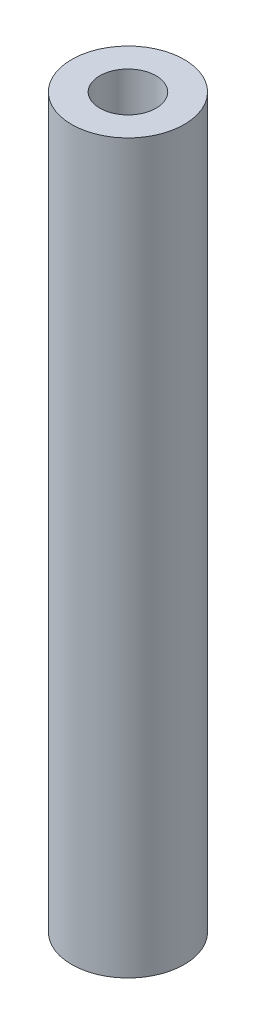
ISO-10303-21;
HEADER;
FILE_DESCRIPTION(('STEP AP214'),'2;1');
FILE_NAME('part.step','',(''),(''),'','','');
FILE_SCHEMA(('AUTOMOTIVE_DESIGN { 1 0 10303 214 1 1 1 1 }'));
ENDSEC;
DATA;
#1=APPLICATION_CONTEXT('core data for automotive mechanical design processes');
#2=APPLICATION_PROTOCOL_DEFINITION('international standard','automotive_design',2000,#1);
#3=PRODUCT_CONTEXT('',#1,'mechanical');
#4=PRODUCT('Part','Part','',(#3));
#5=PRODUCT_RELATED_PRODUCT_CATEGORY('part','',(#4));
#6=PRODUCT_DEFINITION_FORMATION('','',#4);
#7=PRODUCT_DEFINITION_CONTEXT('part definition',#1,'design');
#8=PRODUCT_DEFINITION('design','',#6,#7);
#9=PRODUCT_DEFINITION_SHAPE('','',#8);
#10=(LENGTH_UNIT() NAMED_UNIT(*) SI_UNIT(.MILLI.,.METRE.));
#11=(NAMED_UNIT(*) PLANE_ANGLE_UNIT() SI_UNIT($,.RADIAN.));
#12=(NAMED_UNIT(*) SI_UNIT($,.STERADIAN.) SOLID_ANGLE_UNIT());
#13=UNCERTAINTY_MEASURE_WITH_UNIT(LENGTH_MEASURE(1.E-05),#10,'distance_accuracy_value','');
#14=(GEOMETRIC_REPRESENTATION_CONTEXT(3) GLOBAL_UNCERTAINTY_ASSIGNED_CONTEXT((#13)) GLOBAL_UNIT_ASSIGNED_CONTEXT((#10,
#11,#12)) REPRESENTATION_CONTEXT('',''));
#15=CARTESIAN_POINT('',(0.,0.,0.));
#16=DIRECTION('',(0.,0.,1.));
#17=DIRECTION('',(1.,0.,0.));
#18=AXIS2_PLACEMENT_3D('',#15,#16,#17);
#19=CARTESIAN_POINT('',(0.,82.042,0.));
#20=DIRECTION('',(0.,1.,0.));
#21=DIRECTION('',(0.,0.,1.));
#22=AXIS2_PLACEMENT_3D('',#19,#20,#21);
#23=PLANE('',#22);
#24=CARTESIAN_POINT('',(0.,82.042,0.));
#25=DIRECTION('',(0.,1.,0.));
#26=DIRECTION('',(0.,0.,1.));
#27=AXIS2_PLACEMENT_3D('',#24,#25,#26);
#28=CIRCLE('',#27,6.35);
#29=CARTESIAN_POINT('',(0.,82.042,6.35));
#30=VERTEX_POINT('',#29);
#31=EDGE_CURVE('E10',#30,#30,#28,.T.);
#32=ORIENTED_EDGE('',*,*,#31,.T.);
#33=EDGE_LOOP('',(#32));
#34=FACE_BOUND('',#33,.T.);
#35=CARTESIAN_POINT('',(0.,82.042,0.));
#36=DIRECTION('',(0.,1.,0.));
#37=DIRECTION('',(0.,0.,1.));
#38=AXIS2_PLACEMENT_3D('',#35,#36,#37);
#39=CIRCLE('',#38,3.175);
#40=CARTESIAN_POINT('',(0.,82.042,3.175));
#41=VERTEX_POINT('',#40);
#42=EDGE_CURVE('E42',#41,#41,#39,.T.);
#43=ORIENTED_EDGE('',*,*,#42,.F.);
#44=EDGE_LOOP('',(#43));
#45=FACE_BOUND('',#44,.T.);
#46=ADVANCED_FACE('F31',(#34,#45),#23,.T.);
#47=CARTESIAN_POINT('',(0.,0.,0.));
#48=DIRECTION('',(0.,1.,0.));
#49=DIRECTION('',(0.,0.,1.));
#50=AXIS2_PLACEMENT_3D('',#47,#48,#49);
#51=PLANE('',#50);
#52=CARTESIAN_POINT('',(0.,0.,0.));
#53=DIRECTION('',(0.,1.,0.));
#54=DIRECTION('',(0.,0.,1.));
#55=AXIS2_PLACEMENT_3D('',#52,#53,#54);
#56=CIRCLE('',#55,6.35);
#57=CARTESIAN_POINT('',(0.,0.,6.35));
#58=VERTEX_POINT('',#57);
#59=EDGE_CURVE('E35',#58,#58,#56,.T.);
#60=ORIENTED_EDGE('',*,*,#59,.F.);
#61=EDGE_LOOP('',(#60));
#62=FACE_BOUND('',#61,.T.);
#63=CARTESIAN_POINT('',(0.,0.,0.));
#64=DIRECTION('',(0.,1.,0.));
#65=DIRECTION('',(0.,0.,1.));
#66=AXIS2_PLACEMENT_3D('',#63,#64,#65);
#67=CIRCLE('',#66,3.175);
#68=CARTESIAN_POINT('',(0.,0.,3.175));
#69=VERTEX_POINT('',#68);
#70=EDGE_CURVE('E44',#69,#69,#67,.T.);
#71=ORIENTED_EDGE('',*,*,#70,.T.);
#72=EDGE_LOOP('',(#71));
#73=FACE_BOUND('',#72,.T.);
#74=ADVANCED_FACE('F54',(#62,#73),#51,.F.);
#75=CARTESIAN_POINT('',(0.,82.042,0.));
#76=DIRECTION('',(0.,-1.,0.));
#77=DIRECTION('',(0.,0.,-1.));
#78=AXIS2_PLACEMENT_3D('',#75,#76,#77);
#79=CYLINDRICAL_SURFACE('',#78,6.35);
#80=ORIENTED_EDGE('',*,*,#31,.F.);
#81=EDGE_LOOP('',(#80));
#82=FACE_BOUND('',#81,.T.);
#83=ORIENTED_EDGE('',*,*,#59,.T.);
#84=EDGE_LOOP('',(#83));
#85=FACE_BOUND('',#84,.T.);
#86=ADVANCED_FACE('F33',(#82,#85),#79,.T.);
#87=CARTESIAN_POINT('',(0.,82.042,0.));
#88=DIRECTION('',(0.,-1.,0.));
#89=DIRECTION('',(0.,0.,-1.));
#90=AXIS2_PLACEMENT_3D('',#87,#88,#89);
#91=CYLINDRICAL_SURFACE('',#90,3.175);
#92=ORIENTED_EDGE('',*,*,#42,.T.);
#93=EDGE_LOOP('',(#92));
#94=FACE_BOUND('',#93,.T.);
#95=ORIENTED_EDGE('',*,*,#70,.F.);
#96=EDGE_LOOP('',(#95));
#97=FACE_BOUND('',#96,.T.);
#98=ADVANCED_FACE('F50',(#94,#97),#91,.F.);
#99=CLOSED_SHELL('',(#46,#74,#86,#98));
#100=MANIFOLD_SOLID_BREP('B2',#99);
#101=ADVANCED_BREP_SHAPE_REPRESENTATION('',(#18,#100),#14);
#102=SHAPE_DEFINITION_REPRESENTATION(#9,#101);
ENDSEC;
END-ISO-10303-21;
